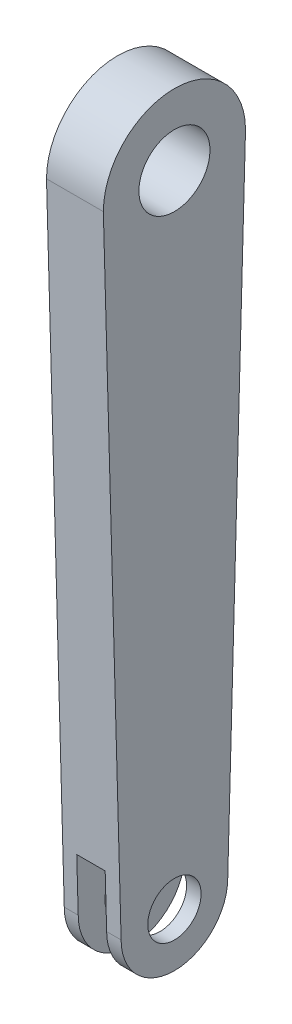
ISO-10303-21;
HEADER;
FILE_DESCRIPTION(('STEP AP214'),'2;1');
FILE_NAME('part.step','',(''),(''),'','','');
FILE_SCHEMA(('AUTOMOTIVE_DESIGN { 1 0 10303 214 1 1 1 1 }'));
ENDSEC;
DATA;
#1=APPLICATION_CONTEXT('core data for automotive mechanical design processes');
#2=APPLICATION_PROTOCOL_DEFINITION('international standard','automotive_design',2000,#1);
#3=PRODUCT_CONTEXT('',#1,'mechanical');
#4=PRODUCT('Part','Part','',(#3));
#5=PRODUCT_RELATED_PRODUCT_CATEGORY('part','',(#4));
#6=PRODUCT_DEFINITION_FORMATION('','',#4);
#7=PRODUCT_DEFINITION_CONTEXT('part definition',#1,'design');
#8=PRODUCT_DEFINITION('design','',#6,#7);
#9=PRODUCT_DEFINITION_SHAPE('','',#8);
#10=(LENGTH_UNIT() NAMED_UNIT(*) SI_UNIT(.MILLI.,.METRE.));
#11=(NAMED_UNIT(*) PLANE_ANGLE_UNIT() SI_UNIT($,.RADIAN.));
#12=(NAMED_UNIT(*) SI_UNIT($,.STERADIAN.) SOLID_ANGLE_UNIT());
#13=UNCERTAINTY_MEASURE_WITH_UNIT(LENGTH_MEASURE(1.E-05),#10,'distance_accuracy_value','');
#14=(GEOMETRIC_REPRESENTATION_CONTEXT(3) GLOBAL_UNCERTAINTY_ASSIGNED_CONTEXT((#13)) GLOBAL_UNIT_ASSIGNED_CONTEXT((#10,
#11,#12)) REPRESENTATION_CONTEXT('',''));
#15=CARTESIAN_POINT('',(0.,0.,0.));
#16=DIRECTION('',(0.,0.,1.));
#17=DIRECTION('',(1.,0.,0.));
#18=AXIS2_PLACEMENT_3D('',#15,#16,#17);
#19=CARTESIAN_POINT('',(16.,-180.,0.));
#20=DIRECTION('',(-1.,0.,0.));
#21=DIRECTION('',(0.,0.,1.));
#22=AXIS2_PLACEMENT_3D('',#19,#20,#21);
#23=CYLINDRICAL_SURFACE('',#22,15.);
#24=CARTESIAN_POINT('',(11.9274315221081,-180.,0.));
#25=DIRECTION('',(-1.,0.,0.));
#26=DIRECTION('',(0.,0.,1.));
#27=AXIS2_PLACEMENT_3D('',#24,#25,#26);
#28=CIRCLE('',#27,15.);
#29=CARTESIAN_POINT('',(11.9274315221081,-180.,-15.));
#30=VERTEX_POINT('',#29);
#31=CARTESIAN_POINT('',(11.9274315221081,-180.,15.));
#32=VERTEX_POINT('',#31);
#33=EDGE_CURVE('E137',#30,#32,#28,.T.);
#34=ORIENTED_EDGE('',*,*,#33,.F.);
#35=DIRECTION('',(-1.,0.,0.));
#36=VECTOR('',#35,1.);
#37=CARTESIAN_POINT('',(16.,-180.,-15.));
#38=LINE('',#37,#36);
#39=CARTESIAN_POINT('',(16.,-180.,-15.));
#40=VERTEX_POINT('',#39);
#41=EDGE_CURVE('E45',#40,#30,#38,.T.);
#42=ORIENTED_EDGE('',*,*,#41,.F.);
#43=CARTESIAN_POINT('',(16.,-180.,0.));
#44=DIRECTION('',(1.,0.,0.));
#45=DIRECTION('',(0.,0.,-1.));
#46=AXIS2_PLACEMENT_3D('',#43,#44,#45);
#47=CIRCLE('',#46,15.);
#48=CARTESIAN_POINT('',(16.,-180.,15.));
#49=VERTEX_POINT('',#48);
#50=EDGE_CURVE('E88',#49,#40,#47,.T.);
#51=ORIENTED_EDGE('',*,*,#50,.F.);
#52=DIRECTION('',(-1.,0.,0.));
#53=VECTOR('',#52,1.);
#54=CARTESIAN_POINT('',(16.,-180.,15.));
#55=LINE('',#54,#53);
#56=EDGE_CURVE('E165',#49,#32,#55,.T.);
#57=ORIENTED_EDGE('',*,*,#56,.T.);
#58=EDGE_LOOP('',(#34,#42,#51,#57));
#59=FACE_BOUND('',#58,.T.);
#60=ADVANCED_FACE('F38',(#59),#23,.T.);
#61=CARTESIAN_POINT('',(3.92743152210811,-180.,0.));
#62=DIRECTION('',(1.,0.,0.));
#63=DIRECTION('',(0.,0.,-1.));
#64=AXIS2_PLACEMENT_3D('',#61,#62,#63);
#65=CIRCLE('',#64,15.);
#66=CARTESIAN_POINT('',(3.92743152210811,-180.,15.));
#67=VERTEX_POINT('',#66);
#68=CARTESIAN_POINT('',(3.9274315221081,-180.,-15.));
#69=VERTEX_POINT('',#68);
#70=EDGE_CURVE('E118',#67,#69,#65,.T.);
#71=ORIENTED_EDGE('',*,*,#70,.F.);
#72=CARTESIAN_POINT('',(0.,-180.,15.));
#73=VERTEX_POINT('',#72);
#74=EDGE_CURVE('E83',#67,#73,#55,.T.);
#75=ORIENTED_EDGE('',*,*,#74,.T.);
#76=CARTESIAN_POINT('',(0.,-180.,0.));
#77=DIRECTION('',(1.,0.,0.));
#78=DIRECTION('',(0.,0.,-1.));
#79=AXIS2_PLACEMENT_3D('',#76,#77,#78);
#80=CIRCLE('',#79,15.);
#81=CARTESIAN_POINT('',(0.,-180.,-15.));
#82=VERTEX_POINT('',#81);
#83=EDGE_CURVE('E144',#73,#82,#80,.T.);
#84=ORIENTED_EDGE('',*,*,#83,.T.);
#85=EDGE_CURVE('E173',#69,#82,#38,.T.);
#86=ORIENTED_EDGE('',*,*,#85,.F.);
#87=EDGE_LOOP('',(#71,#75,#84,#86));
#88=FACE_BOUND('',#87,.T.);
#89=ADVANCED_FACE('F200',(#88),#23,.T.);
#90=CARTESIAN_POINT('',(16.,-0.555127216653819,-19.9845797995374));
#91=DIRECTION('',(0.,-0.0277670672403534,-0.999614420652718));
#92=DIRECTION('',(0.,0.999614420652718,-0.0277670672403534));
#93=AXIS2_PLACEMENT_3D('',#90,#91,#92);
#94=PLANE('',#93);
#95=ORIENTED_EDGE('',*,*,#41,.T.);
#96=DIRECTION('',(0.,0.999614420652718,-0.0277670672403534));
#97=VECTOR('',#96,1.);
#98=CARTESIAN_POINT('',(11.9274315221081,-0.555127216653819,-19.9845797995374));
#99=LINE('',#98,#97);
#100=CARTESIAN_POINT('',(11.9274315221081,-165.,-15.4166666666666));
#101=VERTEX_POINT('',#100);
#102=EDGE_CURVE('E131',#30,#101,#99,.T.);
#103=ORIENTED_EDGE('',*,*,#102,.T.);
#104=DIRECTION('',(1.,0.,0.));
#105=VECTOR('',#104,1.);
#106=CARTESIAN_POINT('',(16.,-165.,-15.4166666666666));
#107=LINE('',#106,#105);
#108=CARTESIAN_POINT('',(3.9274315221081,-165.,-15.4166666666666));
#109=VERTEX_POINT('',#108);
#110=EDGE_CURVE('E125',#109,#101,#107,.T.);
#111=ORIENTED_EDGE('',*,*,#110,.F.);
#112=DIRECTION('',(0.,-0.999614420652718,0.0277670672403534));
#113=VECTOR('',#112,1.);
#114=CARTESIAN_POINT('',(3.9274315221081,-0.555127216653819,-19.9845797995374));
#115=LINE('',#114,#113);
#116=EDGE_CURVE('E112',#109,#69,#115,.T.);
#117=ORIENTED_EDGE('',*,*,#116,.T.);
#118=ORIENTED_EDGE('',*,*,#85,.T.);
#119=DIRECTION('',(0.,-0.999614420652718,0.0277670672403534));
#120=VECTOR('',#119,1.);
#121=CARTESIAN_POINT('',(0.,-0.555127216653819,-19.9845797995374));
#122=LINE('',#121,#120);
#123=CARTESIAN_POINT('',(0.,0.,-20.));
#124=VERTEX_POINT('',#123);
#125=EDGE_CURVE('E159',#124,#82,#122,.T.);
#126=ORIENTED_EDGE('',*,*,#125,.F.);
#127=DIRECTION('',(-1.,0.,0.));
#128=VECTOR('',#127,1.);
#129=CARTESIAN_POINT('',(16.,0.,-20.));
#130=LINE('',#129,#128);
#131=CARTESIAN_POINT('',(16.,0.,-20.));
#132=VERTEX_POINT('',#131);
#133=EDGE_CURVE('E171',#132,#124,#130,.T.);
#134=ORIENTED_EDGE('',*,*,#133,.F.);
#135=DIRECTION('',(0.,-0.999614420652718,0.0277670672403534));
#136=VECTOR('',#135,1.);
#137=CARTESIAN_POINT('',(16.,-0.555127216653819,-19.9845797995374));
#138=LINE('',#137,#136);
#139=EDGE_CURVE('E151',#132,#40,#138,.T.);
#140=ORIENTED_EDGE('',*,*,#139,.T.);
#141=EDGE_LOOP('',(#95,#103,#111,#117,#118,#126,#134,#140));
#142=FACE_BOUND('',#141,.T.);
#143=ADVANCED_FACE('F130',(#142),#94,.T.);
#144=CARTESIAN_POINT('',(16.,-0.555127216653819,19.9845797995374));
#145=DIRECTION('',(0.,0.0277670672403534,-0.999614420652718));
#146=DIRECTION('',(0.,0.999614420652718,0.0277670672403534));
#147=AXIS2_PLACEMENT_3D('',#144,#145,#146);
#148=PLANE('',#147);
#149=DIRECTION('',(0.,0.999614420652718,0.0277670672403534));
#150=VECTOR('',#149,1.);
#151=CARTESIAN_POINT('',(11.9274315221081,-0.555127216653819,19.9845797995374));
#152=LINE('',#151,#150);
#153=CARTESIAN_POINT('',(11.9274315221081,-165.,15.4166666666666));
#154=VERTEX_POINT('',#153);
#155=EDGE_CURVE('E178',#32,#154,#152,.T.);
#156=ORIENTED_EDGE('',*,*,#155,.F.);
#157=ORIENTED_EDGE('',*,*,#56,.F.);
#158=DIRECTION('',(0.,-0.999614420652718,-0.0277670672403534));
#159=VECTOR('',#158,1.);
#160=CARTESIAN_POINT('',(16.,-0.555127216653819,19.9845797995374));
#161=LINE('',#160,#159);
#162=CARTESIAN_POINT('',(16.,0.,20.));
#163=VERTEX_POINT('',#162);
#164=EDGE_CURVE('E61',#163,#49,#161,.T.);
#165=ORIENTED_EDGE('',*,*,#164,.F.);
#166=DIRECTION('',(-1.,0.,0.));
#167=VECTOR('',#166,1.);
#168=CARTESIAN_POINT('',(16.,0.,20.));
#169=LINE('',#168,#167);
#170=CARTESIAN_POINT('',(0.,0.,20.));
#171=VERTEX_POINT('',#170);
#172=EDGE_CURVE('E168',#163,#171,#169,.T.);
#173=ORIENTED_EDGE('',*,*,#172,.T.);
#174=DIRECTION('',(0.,-0.999614420652718,-0.0277670672403534));
#175=VECTOR('',#174,1.);
#176=CARTESIAN_POINT('',(0.,-0.555127216653819,19.9845797995374));
#177=LINE('',#176,#175);
#178=EDGE_CURVE('E152',#171,#73,#177,.T.);
#179=ORIENTED_EDGE('',*,*,#178,.T.);
#180=ORIENTED_EDGE('',*,*,#74,.F.);
#181=DIRECTION('',(0.,-0.999614420652718,-0.0277670672403534));
#182=VECTOR('',#181,1.);
#183=CARTESIAN_POINT('',(3.92743152210811,-0.555127216653819,19.9845797995374));
#184=LINE('',#183,#182);
#185=CARTESIAN_POINT('',(3.92743152210811,-165.,15.4166666666666));
#186=VERTEX_POINT('',#185);
#187=EDGE_CURVE('E176',#186,#67,#184,.T.);
#188=ORIENTED_EDGE('',*,*,#187,.F.);
#189=DIRECTION('',(1.,0.,0.));
#190=VECTOR('',#189,1.);
#191=CARTESIAN_POINT('',(16.,-165.,15.4166666666666));
#192=LINE('',#191,#190);
#193=EDGE_CURVE('E11',#186,#154,#192,.T.);
#194=ORIENTED_EDGE('',*,*,#193,.T.);
#195=EDGE_LOOP('',(#156,#157,#165,#173,#179,#180,#188,#194));
#196=FACE_BOUND('',#195,.T.);
#197=ADVANCED_FACE('F199',(#196),#148,.F.);
#198=CARTESIAN_POINT('',(0.,-180.,0.));
#199=DIRECTION('',(1.,0.,0.));
#200=DIRECTION('',(0.,0.,-1.));
#201=AXIS2_PLACEMENT_3D('',#198,#199,#200);
#202=CYLINDRICAL_SURFACE('',#201,7.50000000000001);
#203=CARTESIAN_POINT('',(16.,-180.,0.));
#204=DIRECTION('',(1.,0.,0.));
#205=DIRECTION('',(0.,0.,-1.));
#206=AXIS2_PLACEMENT_3D('',#203,#204,#205);
#207=CIRCLE('',#206,7.50000000000001);
#208=CARTESIAN_POINT('',(16.,-180.,-7.50000000000003));
#209=VERTEX_POINT('',#208);
#210=EDGE_CURVE('E132',#209,#209,#207,.T.);
#211=ORIENTED_EDGE('',*,*,#210,.T.);
#212=EDGE_LOOP('',(#211));
#213=FACE_BOUND('',#212,.T.);
#214=CARTESIAN_POINT('',(11.9274315221081,-180.,0.));
#215=DIRECTION('',(-1.,0.,0.));
#216=DIRECTION('',(0.,0.,1.));
#217=AXIS2_PLACEMENT_3D('',#214,#215,#216);
#218=CIRCLE('',#217,7.50000000000001);
#219=CARTESIAN_POINT('',(11.9274315221081,-180.,7.49999999999998));
#220=VERTEX_POINT('',#219);
#221=EDGE_CURVE('E122',#220,#220,#218,.F.);
#222=ORIENTED_EDGE('',*,*,#221,.F.);
#223=EDGE_LOOP('',(#222));
#224=FACE_BOUND('',#223,.T.);
#225=ADVANCED_FACE('F228',(#213,#224),#202,.F.);
#226=CARTESIAN_POINT('',(0.,-180.,0.));
#227=DIRECTION('',(1.,0.,0.));
#228=DIRECTION('',(0.,0.,-1.));
#229=AXIS2_PLACEMENT_3D('',#226,#227,#228);
#230=CIRCLE('',#229,7.50000000000001);
#231=CARTESIAN_POINT('',(0.,-180.,-7.50000000000003));
#232=VERTEX_POINT('',#231);
#233=EDGE_CURVE('E135',#232,#232,#230,.T.);
#234=ORIENTED_EDGE('',*,*,#233,.F.);
#235=EDGE_LOOP('',(#234));
#236=FACE_BOUND('',#235,.T.);
#237=CARTESIAN_POINT('',(3.92743152210811,-180.,0.));
#238=DIRECTION('',(1.,0.,0.));
#239=DIRECTION('',(0.,0.,-1.));
#240=AXIS2_PLACEMENT_3D('',#237,#238,#239);
#241=CIRCLE('',#240,7.50000000000001);
#242=CARTESIAN_POINT('',(3.92743152210811,-180.,-7.50000000000003));
#243=VERTEX_POINT('',#242);
#244=EDGE_CURVE('E126',#243,#243,#241,.F.);
#245=ORIENTED_EDGE('',*,*,#244,.F.);
#246=EDGE_LOOP('',(#245));
#247=FACE_BOUND('',#246,.T.);
#248=ADVANCED_FACE('F231',(#236,#247),#202,.F.);
#249=CARTESIAN_POINT('',(16.,0.,0.));
#250=DIRECTION('',(-1.,0.,0.));
#251=DIRECTION('',(0.,0.,1.));
#252=AXIS2_PLACEMENT_3D('',#249,#250,#251);
#253=CYLINDRICAL_SURFACE('',#252,20.);
#254=CARTESIAN_POINT('',(0.,0.,0.));
#255=DIRECTION('',(1.,0.,0.));
#256=DIRECTION('',(0.,0.,-1.));
#257=AXIS2_PLACEMENT_3D('',#254,#255,#256);
#258=CIRCLE('',#257,20.);
#259=EDGE_CURVE('E162',#124,#171,#258,.T.);
#260=ORIENTED_EDGE('',*,*,#259,.T.);
#261=ORIENTED_EDGE('',*,*,#172,.F.);
#262=CARTESIAN_POINT('',(16.,0.,0.));
#263=DIRECTION('',(1.,0.,0.));
#264=DIRECTION('',(0.,0.,-1.));
#265=AXIS2_PLACEMENT_3D('',#262,#263,#264);
#266=CIRCLE('',#265,20.);
#267=EDGE_CURVE('E155',#132,#163,#266,.T.);
#268=ORIENTED_EDGE('',*,*,#267,.F.);
#269=ORIENTED_EDGE('',*,*,#133,.T.);
#270=EDGE_LOOP('',(#260,#261,#268,#269));
#271=FACE_BOUND('',#270,.T.);
#272=ADVANCED_FACE('F195',(#271),#253,.T.);
#273=CARTESIAN_POINT('',(16.,0.,0.));
#274=DIRECTION('',(1.,0.,0.));
#275=DIRECTION('',(0.,0.,-1.));
#276=AXIS2_PLACEMENT_3D('',#273,#274,#275);
#277=PLANE('',#276);
#278=CARTESIAN_POINT('',(16.,0.,0.));
#279=DIRECTION('',(1.,0.,0.));
#280=DIRECTION('',(0.,0.,-1.));
#281=AXIS2_PLACEMENT_3D('',#278,#279,#280);
#282=CIRCLE('',#281,10.);
#283=CARTESIAN_POINT('',(16.,0.,-10.));
#284=VERTEX_POINT('',#283);
#285=EDGE_CURVE('E145',#284,#284,#282,.T.);
#286=ORIENTED_EDGE('',*,*,#285,.F.);
#287=EDGE_LOOP('',(#286));
#288=FACE_BOUND('',#287,.T.);
#289=ORIENTED_EDGE('',*,*,#210,.F.);
#290=EDGE_LOOP('',(#289));
#291=FACE_BOUND('',#290,.T.);
#292=ORIENTED_EDGE('',*,*,#50,.T.);
#293=ORIENTED_EDGE('',*,*,#139,.F.);
#294=ORIENTED_EDGE('',*,*,#267,.T.);
#295=ORIENTED_EDGE('',*,*,#164,.T.);
#296=EDGE_LOOP('',(#292,#293,#294,#295));
#297=FACE_BOUND('',#296,.T.);
#298=ADVANCED_FACE('F192',(#288,#291,#297),#277,.T.);
#299=CARTESIAN_POINT('',(0.,0.,0.));
#300=DIRECTION('',(1.,0.,0.));
#301=DIRECTION('',(0.,0.,-1.));
#302=AXIS2_PLACEMENT_3D('',#299,#300,#301);
#303=PLANE('',#302);
#304=CARTESIAN_POINT('',(0.,0.,0.));
#305=DIRECTION('',(1.,0.,0.));
#306=DIRECTION('',(0.,0.,-1.));
#307=AXIS2_PLACEMENT_3D('',#304,#305,#306);
#308=CIRCLE('',#307,10.);
#309=CARTESIAN_POINT('',(0.,0.,-10.));
#310=VERTEX_POINT('',#309);
#311=EDGE_CURVE('E141',#310,#310,#308,.T.);
#312=ORIENTED_EDGE('',*,*,#311,.T.);
#313=EDGE_LOOP('',(#312));
#314=FACE_BOUND('',#313,.T.);
#315=ORIENTED_EDGE('',*,*,#233,.T.);
#316=EDGE_LOOP('',(#315));
#317=FACE_BOUND('',#316,.T.);
#318=ORIENTED_EDGE('',*,*,#83,.F.);
#319=ORIENTED_EDGE('',*,*,#178,.F.);
#320=ORIENTED_EDGE('',*,*,#259,.F.);
#321=ORIENTED_EDGE('',*,*,#125,.T.);
#322=EDGE_LOOP('',(#318,#319,#320,#321));
#323=FACE_BOUND('',#322,.T.);
#324=ADVANCED_FACE('F203',(#314,#317,#323),#303,.F.);
#325=CARTESIAN_POINT('',(0.,0.,0.));
#326=DIRECTION('',(1.,0.,0.));
#327=DIRECTION('',(0.,0.,-1.));
#328=AXIS2_PLACEMENT_3D('',#325,#326,#327);
#329=CYLINDRICAL_SURFACE('',#328,10.);
#330=ORIENTED_EDGE('',*,*,#311,.F.);
#331=EDGE_LOOP('',(#330));
#332=FACE_BOUND('',#331,.T.);
#333=ORIENTED_EDGE('',*,*,#285,.T.);
#334=EDGE_LOOP('',(#333));
#335=FACE_BOUND('',#334,.T.);
#336=ADVANCED_FACE('F205',(#332,#335),#329,.F.);
#337=CARTESIAN_POINT('',(0.,-165.,0.));
#338=DIRECTION('',(0.,1.,0.));
#339=DIRECTION('',(0.,0.,1.));
#340=AXIS2_PLACEMENT_3D('',#337,#338,#339);
#341=PLANE('',#340);
#342=ORIENTED_EDGE('',*,*,#110,.T.);
#343=DIRECTION('',(0.,0.,-1.));
#344=VECTOR('',#343,1.);
#345=CARTESIAN_POINT('',(11.9274315221081,-165.,-20.));
#346=LINE('',#345,#344);
#347=EDGE_CURVE('E52',#154,#101,#346,.T.);
#348=ORIENTED_EDGE('',*,*,#347,.F.);
#349=ORIENTED_EDGE('',*,*,#193,.F.);
#350=DIRECTION('',(0.,0.,1.));
#351=VECTOR('',#350,1.);
#352=CARTESIAN_POINT('',(3.9274315221081,-165.,-20.));
#353=LINE('',#352,#351);
#354=EDGE_CURVE('E116',#109,#186,#353,.T.);
#355=ORIENTED_EDGE('',*,*,#354,.F.);
#356=EDGE_LOOP('',(#342,#348,#349,#355));
#357=FACE_BOUND('',#356,.T.);
#358=ADVANCED_FACE('F124',(#357),#341,.F.);
#359=CARTESIAN_POINT('',(11.9274315221081,-165.,-20.));
#360=DIRECTION('',(-1.,0.,0.));
#361=DIRECTION('',(0.,0.,1.));
#362=AXIS2_PLACEMENT_3D('',#359,#360,#361);
#363=PLANE('',#362);
#364=ORIENTED_EDGE('',*,*,#33,.T.);
#365=ORIENTED_EDGE('',*,*,#155,.T.);
#366=ORIENTED_EDGE('',*,*,#347,.T.);
#367=ORIENTED_EDGE('',*,*,#102,.F.);
#368=EDGE_LOOP('',(#364,#365,#366,#367));
#369=FACE_BOUND('',#368,.T.);
#370=ORIENTED_EDGE('',*,*,#221,.T.);
#371=EDGE_LOOP('',(#370));
#372=FACE_BOUND('',#371,.T.);
#373=ADVANCED_FACE('F187',(#369,#372),#363,.T.);
#374=CARTESIAN_POINT('',(3.9274315221081,-165.,-20.));
#375=DIRECTION('',(1.,0.,0.));
#376=DIRECTION('',(0.,0.,-1.));
#377=AXIS2_PLACEMENT_3D('',#374,#375,#376);
#378=PLANE('',#377);
#379=ORIENTED_EDGE('',*,*,#354,.T.);
#380=ORIENTED_EDGE('',*,*,#187,.T.);
#381=ORIENTED_EDGE('',*,*,#70,.T.);
#382=ORIENTED_EDGE('',*,*,#116,.F.);
#383=EDGE_LOOP('',(#379,#380,#381,#382));
#384=FACE_BOUND('',#383,.T.);
#385=ORIENTED_EDGE('',*,*,#244,.T.);
#386=EDGE_LOOP('',(#385));
#387=FACE_BOUND('',#386,.T.);
#388=ADVANCED_FACE('F114',(#384,#387),#378,.T.);
#389=CLOSED_SHELL('',(#60,#89,#143,#197,#225,#248,#272,#298,#324,#336,#358,#373,#388));
#390=MANIFOLD_SOLID_BREP('B2',#389);
#391=ADVANCED_BREP_SHAPE_REPRESENTATION('',(#18,#390),#14);
#392=SHAPE_DEFINITION_REPRESENTATION(#9,#391);
ENDSEC;
END-ISO-10303-21;
